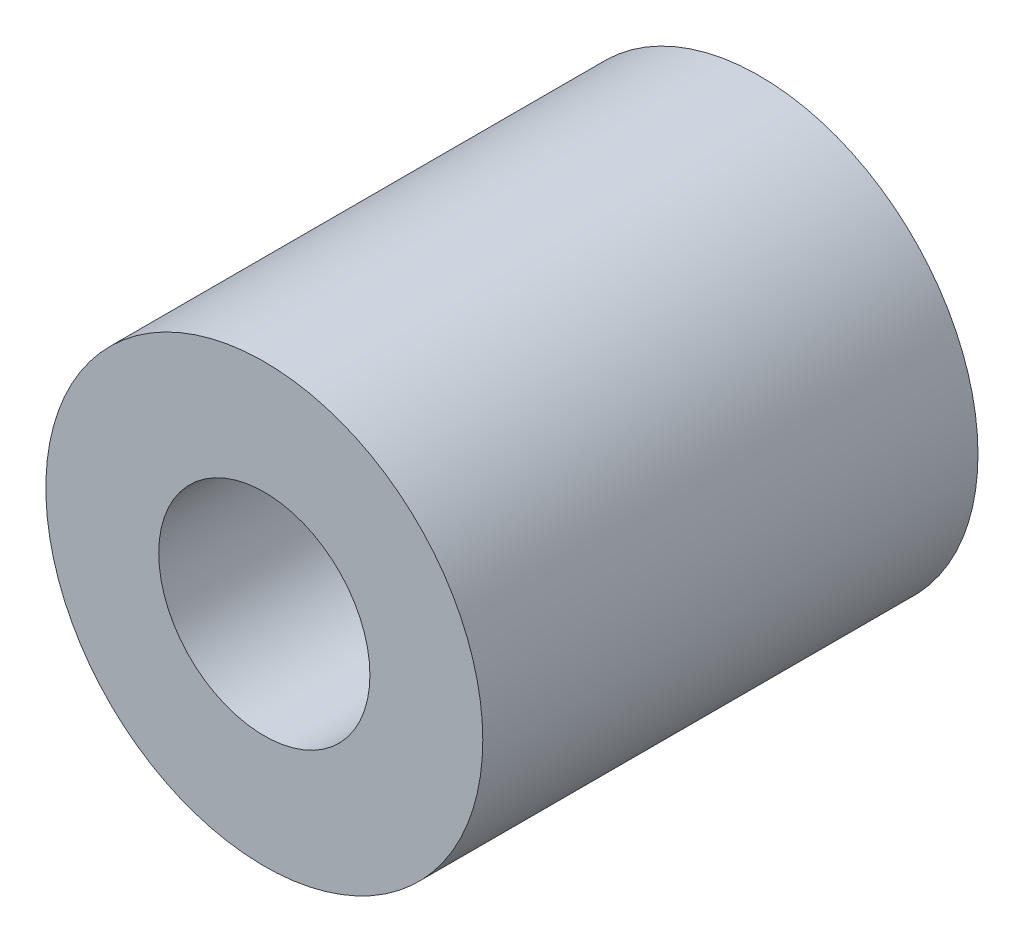
ISO-10303-21;
HEADER;
FILE_DESCRIPTION(('STEP AP214'),'2;1');
FILE_NAME('part.step','',(''),(''),'','','');
FILE_SCHEMA(('AUTOMOTIVE_DESIGN { 1 0 10303 214 1 1 1 1 }'));
ENDSEC;
DATA;
#1=APPLICATION_CONTEXT('core data for automotive mechanical design processes');
#2=APPLICATION_PROTOCOL_DEFINITION('international standard','automotive_design',2000,#1);
#3=PRODUCT_CONTEXT('',#1,'mechanical');
#4=PRODUCT('Part','Part','',(#3));
#5=PRODUCT_RELATED_PRODUCT_CATEGORY('part','',(#4));
#6=PRODUCT_DEFINITION_FORMATION('','',#4);
#7=PRODUCT_DEFINITION_CONTEXT('part definition',#1,'design');
#8=PRODUCT_DEFINITION('design','',#6,#7);
#9=PRODUCT_DEFINITION_SHAPE('','',#8);
#10=(LENGTH_UNIT() NAMED_UNIT(*) SI_UNIT(.MILLI.,.METRE.));
#11=(NAMED_UNIT(*) PLANE_ANGLE_UNIT() SI_UNIT($,.RADIAN.));
#12=(NAMED_UNIT(*) SI_UNIT($,.STERADIAN.) SOLID_ANGLE_UNIT());
#13=UNCERTAINTY_MEASURE_WITH_UNIT(LENGTH_MEASURE(1.E-05),#10,'distance_accuracy_value','');
#14=(GEOMETRIC_REPRESENTATION_CONTEXT(3) GLOBAL_UNCERTAINTY_ASSIGNED_CONTEXT((#13)) GLOBAL_UNIT_ASSIGNED_CONTEXT((#10,
#11,#12)) REPRESENTATION_CONTEXT('',''));
#15=CARTESIAN_POINT('',(0.,0.,0.));
#16=DIRECTION('',(0.,0.,1.));
#17=DIRECTION('',(1.,0.,0.));
#18=AXIS2_PLACEMENT_3D('',#15,#16,#17);
#19=CARTESIAN_POINT('',(0.,0.,34.));
#20=DIRECTION('',(0.,0.,-1.));
#21=DIRECTION('',(-1.,0.,0.));
#22=AXIS2_PLACEMENT_3D('',#19,#20,#21);
#23=CYLINDRICAL_SURFACE('',#22,15.);
#24=CARTESIAN_POINT('',(0.,0.,34.));
#25=DIRECTION('',(0.,0.,1.));
#26=DIRECTION('',(1.,0.,0.));
#27=AXIS2_PLACEMENT_3D('',#24,#25,#26);
#28=CIRCLE('',#27,15.);
#29=CARTESIAN_POINT('',(15.,0.,34.));
#30=VERTEX_POINT('',#29);
#31=EDGE_CURVE('E10',#30,#30,#28,.T.);
#32=ORIENTED_EDGE('',*,*,#31,.F.);
#33=EDGE_LOOP('',(#32));
#34=FACE_BOUND('',#33,.T.);
#35=CARTESIAN_POINT('',(0.,0.,0.));
#36=DIRECTION('',(0.,0.,1.));
#37=DIRECTION('',(1.,0.,0.));
#38=AXIS2_PLACEMENT_3D('',#35,#36,#37);
#39=CIRCLE('',#38,15.);
#40=CARTESIAN_POINT('',(15.,0.,0.));
#41=VERTEX_POINT('',#40);
#42=EDGE_CURVE('E40',#41,#41,#39,.T.);
#43=ORIENTED_EDGE('',*,*,#42,.T.);
#44=EDGE_LOOP('',(#43));
#45=FACE_BOUND('',#44,.T.);
#46=ADVANCED_FACE('F37',(#34,#45),#23,.T.);
#47=CARTESIAN_POINT('',(0.,0.,34.));
#48=DIRECTION('',(0.,0.,1.));
#49=DIRECTION('',(1.,0.,0.));
#50=AXIS2_PLACEMENT_3D('',#47,#48,#49);
#51=PLANE('',#50);
#52=CARTESIAN_POINT('',(0.,0.,34.));
#53=DIRECTION('',(0.,0.,1.));
#54=DIRECTION('',(1.,0.,0.));
#55=AXIS2_PLACEMENT_3D('',#52,#53,#54);
#56=CIRCLE('',#55,7.25);
#57=CARTESIAN_POINT('',(7.25,0.,34.));
#58=VERTEX_POINT('',#57);
#59=EDGE_CURVE('E62',#58,#58,#56,.T.);
#60=ORIENTED_EDGE('',*,*,#59,.F.);
#61=EDGE_LOOP('',(#60));
#62=FACE_BOUND('',#61,.T.);
#63=ORIENTED_EDGE('',*,*,#31,.T.);
#64=EDGE_LOOP('',(#63));
#65=FACE_BOUND('',#64,.T.);
#66=ADVANCED_FACE('F70',(#62,#65),#51,.T.);
#67=CARTESIAN_POINT('',(0.,0.,0.));
#68=DIRECTION('',(0.,0.,1.));
#69=DIRECTION('',(1.,0.,0.));
#70=AXIS2_PLACEMENT_3D('',#67,#68,#69);
#71=PLANE('',#70);
#72=CARTESIAN_POINT('',(0.,0.,0.));
#73=DIRECTION('',(0.,0.,1.));
#74=DIRECTION('',(1.,0.,0.));
#75=AXIS2_PLACEMENT_3D('',#72,#73,#74);
#76=CIRCLE('',#75,3.175);
#77=CARTESIAN_POINT('',(3.175,0.,0.));
#78=VERTEX_POINT('',#77);
#79=EDGE_CURVE('E49',#78,#78,#76,.T.);
#80=ORIENTED_EDGE('',*,*,#79,.T.);
#81=EDGE_LOOP('',(#80));
#82=FACE_BOUND('',#81,.T.);
#83=ORIENTED_EDGE('',*,*,#42,.F.);
#84=EDGE_LOOP('',(#83));
#85=FACE_BOUND('',#84,.T.);
#86=ADVANCED_FACE('F72',(#82,#85),#71,.F.);
#87=CARTESIAN_POINT('',(0.,0.,34.));
#88=DIRECTION('',(0.,0.,1.));
#89=DIRECTION('',(1.,0.,0.));
#90=AXIS2_PLACEMENT_3D('',#87,#88,#89);
#91=CYLINDRICAL_SURFACE('',#90,3.175);
#92=CARTESIAN_POINT('',(0.,0.,17.));
#93=DIRECTION('',(0.,0.,1.));
#94=DIRECTION('',(1.,0.,0.));
#95=AXIS2_PLACEMENT_3D('',#92,#93,#94);
#96=CIRCLE('',#95,3.175);
#97=CARTESIAN_POINT('',(3.175,0.,17.));
#98=VERTEX_POINT('',#97);
#99=EDGE_CURVE('E54',#98,#98,#96,.T.);
#100=ORIENTED_EDGE('',*,*,#99,.T.);
#101=EDGE_LOOP('',(#100));
#102=FACE_BOUND('',#101,.T.);
#103=ORIENTED_EDGE('',*,*,#79,.F.);
#104=EDGE_LOOP('',(#103));
#105=FACE_BOUND('',#104,.T.);
#106=ADVANCED_FACE('F78',(#102,#105),#91,.F.);
#107=CARTESIAN_POINT('',(0.,3.175,17.));
#108=DIRECTION('',(0.,0.,1.));
#109=DIRECTION('',(1.,0.,0.));
#110=AXIS2_PLACEMENT_3D('',#107,#108,#109);
#111=PLANE('',#110);
#112=CARTESIAN_POINT('',(0.,0.,17.));
#113=DIRECTION('',(0.,0.,1.));
#114=DIRECTION('',(1.,0.,0.));
#115=AXIS2_PLACEMENT_3D('',#112,#113,#114);
#116=CIRCLE('',#115,7.25);
#117=CARTESIAN_POINT('',(7.25,0.,17.));
#118=VERTEX_POINT('',#117);
#119=EDGE_CURVE('E58',#118,#118,#116,.T.);
#120=ORIENTED_EDGE('',*,*,#119,.T.);
#121=EDGE_LOOP('',(#120));
#122=FACE_BOUND('',#121,.T.);
#123=ORIENTED_EDGE('',*,*,#99,.F.);
#124=EDGE_LOOP('',(#123));
#125=FACE_BOUND('',#124,.T.);
#126=ADVANCED_FACE('F84',(#122,#125),#111,.T.);
#127=CARTESIAN_POINT('',(0.,0.,34.));
#128=DIRECTION('',(0.,0.,1.));
#129=DIRECTION('',(1.,0.,0.));
#130=AXIS2_PLACEMENT_3D('',#127,#128,#129);
#131=CYLINDRICAL_SURFACE('',#130,7.25);
#132=ORIENTED_EDGE('',*,*,#59,.T.);
#133=EDGE_LOOP('',(#132));
#134=FACE_BOUND('',#133,.T.);
#135=ORIENTED_EDGE('',*,*,#119,.F.);
#136=EDGE_LOOP('',(#135));
#137=FACE_BOUND('',#136,.T.);
#138=ADVANCED_FACE('F67',(#134,#137),#131,.F.);
#139=CLOSED_SHELL('',(#46,#66,#86,#106,#126,#138));
#140=MANIFOLD_SOLID_BREP('B2',#139);
#141=ADVANCED_BREP_SHAPE_REPRESENTATION('',(#18,#140),#14);
#142=SHAPE_DEFINITION_REPRESENTATION(#9,#141);
ENDSEC;
END-ISO-10303-21;
